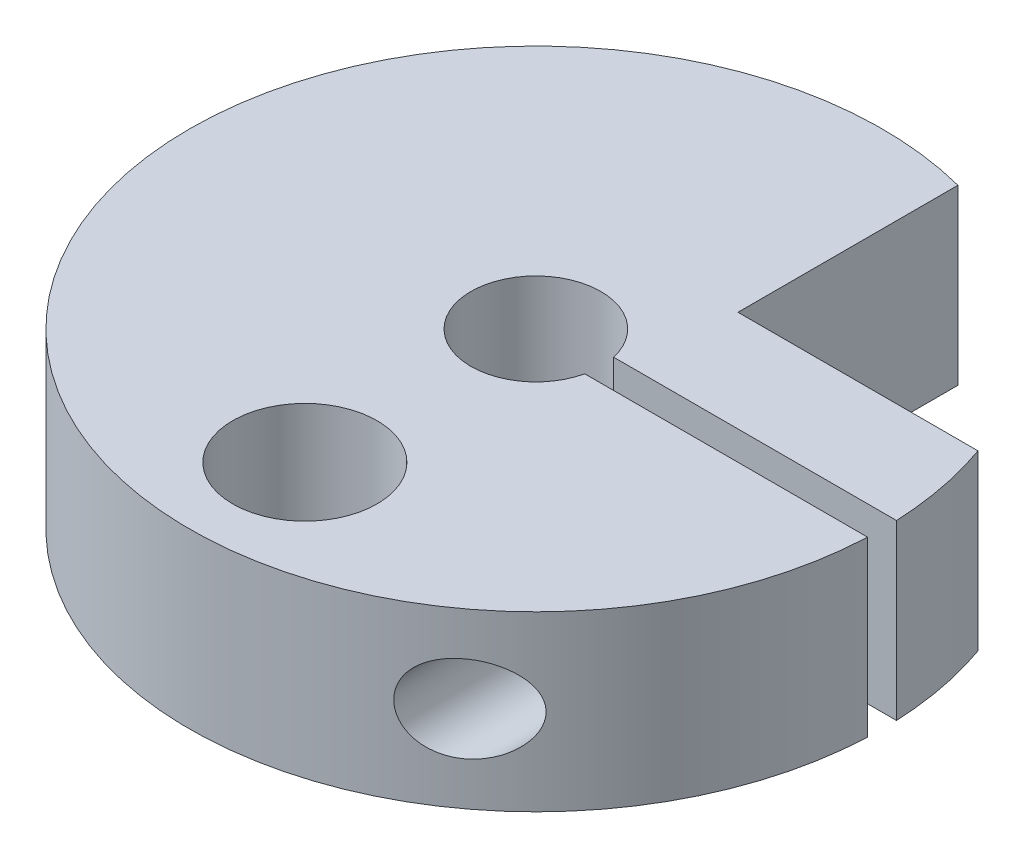
ISO-10303-21;
HEADER;
FILE_DESCRIPTION(('STEP AP214'),'2;1');
FILE_NAME('part.step','',(''),(''),'','','');
FILE_SCHEMA(('AUTOMOTIVE_DESIGN { 1 0 10303 214 1 1 1 1 }'));
ENDSEC;
DATA;
#1=APPLICATION_CONTEXT('core data for automotive mechanical design processes');
#2=APPLICATION_PROTOCOL_DEFINITION('international standard','automotive_design',2000,#1);
#3=PRODUCT_CONTEXT('',#1,'mechanical');
#4=PRODUCT('Part','Part','',(#3));
#5=PRODUCT_RELATED_PRODUCT_CATEGORY('part','',(#4));
#6=PRODUCT_DEFINITION_FORMATION('','',#4);
#7=PRODUCT_DEFINITION_CONTEXT('part definition',#1,'design');
#8=PRODUCT_DEFINITION('design','',#6,#7);
#9=PRODUCT_DEFINITION_SHAPE('','',#8);
#10=(LENGTH_UNIT() NAMED_UNIT(*) SI_UNIT(.MILLI.,.METRE.));
#11=(NAMED_UNIT(*) PLANE_ANGLE_UNIT() SI_UNIT($,.RADIAN.));
#12=(NAMED_UNIT(*) SI_UNIT($,.STERADIAN.) SOLID_ANGLE_UNIT());
#13=UNCERTAINTY_MEASURE_WITH_UNIT(LENGTH_MEASURE(1.E-05),#10,'distance_accuracy_value','');
#14=(GEOMETRIC_REPRESENTATION_CONTEXT(3) GLOBAL_UNCERTAINTY_ASSIGNED_CONTEXT((#13)) GLOBAL_UNIT_ASSIGNED_CONTEXT((#10,
#11,#12)) REPRESENTATION_CONTEXT('',''));
#15=CARTESIAN_POINT('',(0.,0.,0.));
#16=DIRECTION('',(0.,0.,1.));
#17=DIRECTION('',(1.,0.,0.));
#18=AXIS2_PLACEMENT_3D('',#15,#16,#17);
#19=CARTESIAN_POINT('',(0.,6.,0.));
#20=DIRECTION('',(0.,1.,0.));
#21=DIRECTION('',(0.,0.,1.));
#22=AXIS2_PLACEMENT_3D('',#19,#20,#21);
#23=PLANE('',#22);
#24=CARTESIAN_POINT('',(0.,6.,0.));
#25=DIRECTION('',(0.,-1.,0.));
#26=DIRECTION('',(0.,0.,1.));
#27=AXIS2_PLACEMENT_3D('',#24,#25,#26);
#28=CIRCLE('',#27,2.25);
#29=CARTESIAN_POINT('',(2.19374109684803,6.,0.5));
#30=VERTEX_POINT('',#29);
#31=CARTESIAN_POINT('',(2.19374109684803,6.,-0.5));
#32=VERTEX_POINT('',#31);
#33=EDGE_CURVE('E162',#30,#32,#28,.T.);
#34=ORIENTED_EDGE('',*,*,#33,.T.);
#35=DIRECTION('',(1.,0.,0.));
#36=VECTOR('',#35,1.);
#37=CARTESIAN_POINT('',(2.19374109684803,6.,-0.5));
#38=LINE('',#37,#36);
#39=CARTESIAN_POINT('',(11.9895788082818,6.,-0.5));
#40=VERTEX_POINT('',#39);
#41=EDGE_CURVE('E104',#32,#40,#38,.T.);
#42=ORIENTED_EDGE('',*,*,#41,.T.);
#43=CARTESIAN_POINT('',(0.,6.,0.));
#44=DIRECTION('',(0.,1.,0.));
#45=DIRECTION('',(0.,0.,1.));
#46=AXIS2_PLACEMENT_3D('',#43,#44,#45);
#47=CIRCLE('',#46,12.);
#48=CARTESIAN_POINT('',(11.3137084989848,6.,-4.));
#49=VERTEX_POINT('',#48);
#50=EDGE_CURVE('E180',#40,#49,#47,.T.);
#51=ORIENTED_EDGE('',*,*,#50,.T.);
#52=DIRECTION('',(-1.,0.,0.));
#53=VECTOR('',#52,1.);
#54=CARTESIAN_POINT('',(3.,6.,-4.));
#55=LINE('',#54,#53);
#56=CARTESIAN_POINT('',(3.,6.,-4.));
#57=VERTEX_POINT('',#56);
#58=EDGE_CURVE('E120',#49,#57,#55,.T.);
#59=ORIENTED_EDGE('',*,*,#58,.T.);
#60=DIRECTION('',(0.,0.,-1.));
#61=VECTOR('',#60,1.);
#62=CARTESIAN_POINT('',(3.,6.,-11.6189500386223));
#63=LINE('',#62,#61);
#64=CARTESIAN_POINT('',(3.,6.,-11.6189500386223));
#65=VERTEX_POINT('',#64);
#66=EDGE_CURVE('E114',#57,#65,#63,.T.);
#67=ORIENTED_EDGE('',*,*,#66,.T.);
#68=CARTESIAN_POINT('',(0.,6.,0.));
#69=DIRECTION('',(0.,1.,0.));
#70=DIRECTION('',(0.,0.,1.));
#71=AXIS2_PLACEMENT_3D('',#68,#69,#70);
#72=CIRCLE('',#71,12.);
#73=CARTESIAN_POINT('',(11.9895788082818,6.,0.5));
#74=VERTEX_POINT('',#73);
#75=EDGE_CURVE('E118',#65,#74,#72,.T.);
#76=ORIENTED_EDGE('',*,*,#75,.T.);
#77=DIRECTION('',(-1.,0.,0.));
#78=VECTOR('',#77,1.);
#79=CARTESIAN_POINT('',(2.19374109684803,6.,0.5));
#80=LINE('',#79,#78);
#81=EDGE_CURVE('E64',#74,#30,#80,.T.);
#82=ORIENTED_EDGE('',*,*,#81,.T.);
#83=EDGE_LOOP('',(#34,#42,#51,#59,#67,#76,#82));
#84=FACE_BOUND('',#83,.T.);
#85=CARTESIAN_POINT('',(0.,6.,8.));
#86=DIRECTION('',(0.,1.,0.));
#87=DIRECTION('',(0.,0.,1.));
#88=AXIS2_PLACEMENT_3D('',#85,#86,#87);
#89=CIRCLE('',#88,2.5);
#90=CARTESIAN_POINT('',(0.,6.,10.5));
#91=VERTEX_POINT('',#90);
#92=EDGE_CURVE('E147',#91,#91,#89,.T.);
#93=ORIENTED_EDGE('',*,*,#92,.F.);
#94=EDGE_LOOP('',(#93));
#95=FACE_BOUND('',#94,.T.);
#96=ADVANCED_FACE('F45',(#84,#95),#23,.T.);
#97=CARTESIAN_POINT('',(0.,0.,0.));
#98=DIRECTION('',(0.,1.,0.));
#99=DIRECTION('',(0.,0.,1.));
#100=AXIS2_PLACEMENT_3D('',#97,#98,#99);
#101=PLANE('',#100);
#102=CARTESIAN_POINT('',(0.,0.,0.));
#103=DIRECTION('',(0.,-1.,0.));
#104=DIRECTION('',(0.,0.,1.));
#105=AXIS2_PLACEMENT_3D('',#102,#103,#104);
#106=CIRCLE('',#105,2.25);
#107=CARTESIAN_POINT('',(2.19374109684803,0.,0.5));
#108=VERTEX_POINT('',#107);
#109=CARTESIAN_POINT('',(2.19374109684803,0.,-0.5));
#110=VERTEX_POINT('',#109);
#111=EDGE_CURVE('E142',#108,#110,#106,.T.);
#112=ORIENTED_EDGE('',*,*,#111,.F.);
#113=DIRECTION('',(-1.,0.,0.));
#114=VECTOR('',#113,1.);
#115=CARTESIAN_POINT('',(2.19374109684803,0.,0.5));
#116=LINE('',#115,#114);
#117=CARTESIAN_POINT('',(11.9895788082818,0.,0.5));
#118=VERTEX_POINT('',#117);
#119=EDGE_CURVE('E96',#118,#108,#116,.T.);
#120=ORIENTED_EDGE('',*,*,#119,.F.);
#121=CARTESIAN_POINT('',(0.,0.,0.));
#122=DIRECTION('',(0.,1.,0.));
#123=DIRECTION('',(0.,0.,1.));
#124=AXIS2_PLACEMENT_3D('',#121,#122,#123);
#125=CIRCLE('',#124,12.);
#126=CARTESIAN_POINT('',(3.,0.,-11.6189500386223));
#127=VERTEX_POINT('',#126);
#128=EDGE_CURVE('E90',#127,#118,#125,.T.);
#129=ORIENTED_EDGE('',*,*,#128,.F.);
#130=DIRECTION('',(0.,0.,-1.));
#131=VECTOR('',#130,1.);
#132=CARTESIAN_POINT('',(3.,0.,-11.6189500386223));
#133=LINE('',#132,#131);
#134=CARTESIAN_POINT('',(3.,0.,-4.));
#135=VERTEX_POINT('',#134);
#136=EDGE_CURVE('E129',#135,#127,#133,.T.);
#137=ORIENTED_EDGE('',*,*,#136,.F.);
#138=DIRECTION('',(-1.,0.,0.));
#139=VECTOR('',#138,1.);
#140=CARTESIAN_POINT('',(3.,0.,-4.));
#141=LINE('',#140,#139);
#142=CARTESIAN_POINT('',(11.3137084989848,0.,-4.));
#143=VERTEX_POINT('',#142);
#144=EDGE_CURVE('E153',#143,#135,#141,.T.);
#145=ORIENTED_EDGE('',*,*,#144,.F.);
#146=CARTESIAN_POINT('',(0.,0.,0.));
#147=DIRECTION('',(0.,1.,0.));
#148=DIRECTION('',(0.,0.,1.));
#149=AXIS2_PLACEMENT_3D('',#146,#147,#148);
#150=CIRCLE('',#149,12.);
#151=CARTESIAN_POINT('',(11.9895788082818,0.,-0.5));
#152=VERTEX_POINT('',#151);
#153=EDGE_CURVE('E150',#152,#143,#150,.T.);
#154=ORIENTED_EDGE('',*,*,#153,.F.);
#155=DIRECTION('',(1.,0.,0.));
#156=VECTOR('',#155,1.);
#157=CARTESIAN_POINT('',(2.19374109684803,0.,-0.5));
#158=LINE('',#157,#156);
#159=EDGE_CURVE('E146',#110,#152,#158,.T.);
#160=ORIENTED_EDGE('',*,*,#159,.F.);
#161=EDGE_LOOP('',(#112,#120,#129,#137,#145,#154,#160));
#162=FACE_BOUND('',#161,.T.);
#163=CARTESIAN_POINT('',(0.,0.,8.));
#164=DIRECTION('',(0.,1.,0.));
#165=DIRECTION('',(0.,0.,1.));
#166=AXIS2_PLACEMENT_3D('',#163,#164,#165);
#167=CIRCLE('',#166,2.5);
#168=CARTESIAN_POINT('',(0.,0.,10.5));
#169=VERTEX_POINT('',#168);
#170=EDGE_CURVE('E196',#169,#169,#167,.T.);
#171=ORIENTED_EDGE('',*,*,#170,.T.);
#172=EDGE_LOOP('',(#171));
#173=FACE_BOUND('',#172,.T.);
#174=ADVANCED_FACE('F184',(#162,#173),#101,.F.);
#175=CARTESIAN_POINT('',(0.,6.,0.));
#176=DIRECTION('',(0.,-1.,0.));
#177=DIRECTION('',(0.,0.,-1.));
#178=AXIS2_PLACEMENT_3D('',#175,#176,#177);
#179=CYLINDRICAL_SURFACE('',#178,2.25);
#180=ORIENTED_EDGE('',*,*,#111,.T.);
#181=DIRECTION('',(0.,-1.,0.));
#182=VECTOR('',#181,1.);
#183=CARTESIAN_POINT('',(2.19374109684803,6.,-0.5));
#184=LINE('',#183,#182);
#185=EDGE_CURVE('E11',#32,#110,#184,.T.);
#186=ORIENTED_EDGE('',*,*,#185,.F.);
#187=ORIENTED_EDGE('',*,*,#33,.F.);
#188=DIRECTION('',(0.,-1.,0.));
#189=VECTOR('',#188,1.);
#190=CARTESIAN_POINT('',(2.19374109684803,6.,0.5));
#191=LINE('',#190,#189);
#192=EDGE_CURVE('E138',#30,#108,#191,.T.);
#193=ORIENTED_EDGE('',*,*,#192,.T.);
#194=EDGE_LOOP('',(#180,#186,#187,#193));
#195=FACE_BOUND('',#194,.T.);
#196=ADVANCED_FACE('F47',(#195),#179,.F.);
#197=CARTESIAN_POINT('',(2.19374109684803,6.,-0.5));
#198=DIRECTION('',(0.,0.,-1.));
#199=DIRECTION('',(-1.,0.,0.));
#200=AXIS2_PLACEMENT_3D('',#197,#198,#199);
#201=PLANE('',#200);
#202=CARTESIAN_POINT('',(7.16,3.,-0.5));
#203=DIRECTION('',(0.,0.,-1.));
#204=DIRECTION('',(-1.,0.,0.));
#205=AXIS2_PLACEMENT_3D('',#202,#203,#204);
#206=CIRCLE('',#205,1.5);
#207=CARTESIAN_POINT('',(5.66,3.,-0.5));
#208=VERTEX_POINT('',#207);
#209=EDGE_CURVE('E200',#208,#208,#206,.T.);
#210=ORIENTED_EDGE('',*,*,#209,.T.);
#211=EDGE_LOOP('',(#210));
#212=FACE_BOUND('',#211,.T.);
#213=ORIENTED_EDGE('',*,*,#159,.T.);
#214=DIRECTION('',(0.,-1.,0.));
#215=VECTOR('',#214,1.);
#216=CARTESIAN_POINT('',(11.9895788082818,6.,-0.5));
#217=LINE('',#216,#215);
#218=EDGE_CURVE('E56',#40,#152,#217,.T.);
#219=ORIENTED_EDGE('',*,*,#218,.F.);
#220=ORIENTED_EDGE('',*,*,#41,.F.);
#221=ORIENTED_EDGE('',*,*,#185,.T.);
#222=EDGE_LOOP('',(#213,#219,#220,#221));
#223=FACE_BOUND('',#222,.T.);
#224=ADVANCED_FACE('F257',(#212,#223),#201,.F.);
#225=CARTESIAN_POINT('',(0.,6.,0.));
#226=DIRECTION('',(0.,-1.,0.));
#227=DIRECTION('',(0.,0.,-1.));
#228=AXIS2_PLACEMENT_3D('',#225,#226,#227);
#229=CYLINDRICAL_SURFACE('',#228,12.);
#230=ORIENTED_EDGE('',*,*,#153,.T.);
#231=DIRECTION('',(0.,-1.,0.));
#232=VECTOR('',#231,1.);
#233=CARTESIAN_POINT('',(11.3137084989848,6.,-4.));
#234=LINE('',#233,#232);
#235=EDGE_CURVE('E169',#49,#143,#234,.T.);
#236=ORIENTED_EDGE('',*,*,#235,.F.);
#237=ORIENTED_EDGE('',*,*,#50,.F.);
#238=ORIENTED_EDGE('',*,*,#218,.T.);
#239=EDGE_LOOP('',(#230,#236,#237,#238));
#240=FACE_BOUND('',#239,.T.);
#241=ADVANCED_FACE('F178',(#240),#229,.T.);
#242=CARTESIAN_POINT('',(3.,6.,-4.));
#243=DIRECTION('',(0.,0.,1.));
#244=DIRECTION('',(1.,0.,0.));
#245=AXIS2_PLACEMENT_3D('',#242,#243,#244);
#246=PLANE('',#245);
#247=CARTESIAN_POINT('',(7.16,3.,-4.));
#248=DIRECTION('',(0.,0.,-1.));
#249=DIRECTION('',(-1.,0.,0.));
#250=AXIS2_PLACEMENT_3D('',#247,#248,#249);
#251=CIRCLE('',#250,1.5);
#252=CARTESIAN_POINT('',(5.66,3.,-4.));
#253=VERTEX_POINT('',#252);
#254=EDGE_CURVE('E216',#253,#253,#251,.T.);
#255=ORIENTED_EDGE('',*,*,#254,.F.);
#256=EDGE_LOOP('',(#255));
#257=FACE_BOUND('',#256,.T.);
#258=ORIENTED_EDGE('',*,*,#144,.T.);
#259=DIRECTION('',(0.,-1.,0.));
#260=VECTOR('',#259,1.);
#261=CARTESIAN_POINT('',(3.,6.,-4.));
#262=LINE('',#261,#260);
#263=EDGE_CURVE('E131',#57,#135,#262,.T.);
#264=ORIENTED_EDGE('',*,*,#263,.F.);
#265=ORIENTED_EDGE('',*,*,#58,.F.);
#266=ORIENTED_EDGE('',*,*,#235,.T.);
#267=EDGE_LOOP('',(#258,#264,#265,#266));
#268=FACE_BOUND('',#267,.T.);
#269=ADVANCED_FACE('F187',(#257,#268),#246,.F.);
#270=CARTESIAN_POINT('',(3.,6.,-11.6189500386223));
#271=DIRECTION('',(-1.,0.,0.));
#272=DIRECTION('',(0.,0.,1.));
#273=AXIS2_PLACEMENT_3D('',#270,#271,#272);
#274=PLANE('',#273);
#275=ORIENTED_EDGE('',*,*,#136,.T.);
#276=DIRECTION('',(0.,-1.,0.));
#277=VECTOR('',#276,1.);
#278=CARTESIAN_POINT('',(3.,6.,-11.6189500386223));
#279=LINE('',#278,#277);
#280=EDGE_CURVE('E126',#65,#127,#279,.T.);
#281=ORIENTED_EDGE('',*,*,#280,.F.);
#282=ORIENTED_EDGE('',*,*,#66,.F.);
#283=ORIENTED_EDGE('',*,*,#263,.T.);
#284=EDGE_LOOP('',(#275,#281,#282,#283));
#285=FACE_BOUND('',#284,.T.);
#286=ADVANCED_FACE('F127',(#285),#274,.F.);
#287=CARTESIAN_POINT('',(0.,6.,0.));
#288=DIRECTION('',(0.,-1.,0.));
#289=DIRECTION('',(0.,0.,-1.));
#290=AXIS2_PLACEMENT_3D('',#287,#288,#289);
#291=CYLINDRICAL_SURFACE('',#290,12.);
#292=CARTESIAN_POINT('',(5.66,3.,10.5813231686779));
#293=CARTESIAN_POINT('',(5.65999700616026,3.07650820540452,10.5813243336983));
#294=CARTESIAN_POINT('',(5.66587599755908,3.1529985119283,10.5781862389138));
#295=CARTESIAN_POINT('',(5.68908767730524,3.3036847392857,10.5657206838779));
#296=CARTESIAN_POINT('',(5.70641803447849,3.37788112387958,10.5563944833483));
#297=CARTESIAN_POINT('',(5.75165340220269,3.52176597729793,10.5318154686848));
#298=CARTESIAN_POINT('',(5.77953931062155,3.59146232460138,10.5165733591753));
#299=CARTESIAN_POINT('',(5.84463127829465,3.72478377224544,10.4805373499687));
#300=CARTESIAN_POINT('',(5.88183883538463,3.78840789460824,10.4597425580114));
#301=CARTESIAN_POINT('',(5.96557000191042,3.91050355829342,10.4122220420786));
#302=CARTESIAN_POINT('',(6.0123857533211,3.96869977181699,10.3853064221651));
#303=CARTESIAN_POINT('',(6.11260652418617,4.07627971511422,10.3266360814422));
#304=CARTESIAN_POINT('',(6.16601348192594,4.12566084212875,10.2948799365243));
#305=CARTESIAN_POINT('',(6.28370680107082,4.21999751906684,10.223514543651));
#306=CARTESIAN_POINT('',(6.34854524828617,4.26390025756825,10.1834276390037));
#307=CARTESIAN_POINT('',(6.48204084846356,4.34025915279714,10.0989800195129));
#308=CARTESIAN_POINT('',(6.55070000853581,4.37270922618471,10.0546170492203));
#309=CARTESIAN_POINT('',(6.70044240188436,4.43044386693144,9.95556474295889));
#310=CARTESIAN_POINT('',(6.78184995937123,4.45393499659957,9.90032260486398));
#311=CARTESIAN_POINT('',(6.94512090290938,4.48686701169944,9.78648188367212));
#312=CARTESIAN_POINT('',(7.02698448413241,4.49630132854661,9.72788174469398));
#313=CARTESIAN_POINT('',(7.20309014629751,4.5023814334086,9.59840225329666));
#314=CARTESIAN_POINT('',(7.29711227183649,4.49662409228698,9.5271085572571));
#315=CARTESIAN_POINT('',(7.48147688002817,4.46811805839233,9.38302900874874));
#316=CARTESIAN_POINT('',(7.57181459629541,4.4453480490389,9.31024139579678));
#317=CARTESIAN_POINT('',(7.75832690146627,4.3794988753193,9.15559116228408));
#318=CARTESIAN_POINT('',(7.85375169051823,4.33417920311169,9.0737688169711));
#319=CARTESIAN_POINT('',(8.03507429166732,4.22292561480007,8.91359366409502));
#320=CARTESIAN_POINT('',(8.12098219743411,4.1570138279427,8.83523723460475));
#321=CARTESIAN_POINT('',(8.25465085701844,4.02830108884605,8.71012653598015));
#322=CARTESIAN_POINT('',(8.30586658786722,3.97114894340379,8.66123373487834));
#323=CARTESIAN_POINT('',(8.40065751337922,3.8466801937652,8.56932204719236));
#324=CARTESIAN_POINT('',(8.44424643942856,3.779382271595,8.52629263566041));
#325=CARTESIAN_POINT('',(8.51263278889461,3.65143101383627,8.45794698756353));
#326=CARTESIAN_POINT('',(8.53944559094192,3.59282486525614,8.43083430767719));
#327=CARTESIAN_POINT('',(8.58590913270392,3.47018260848796,8.38351151948522));
#328=CARTESIAN_POINT('',(8.60556486761207,3.40615032603379,8.36329659759011));
#329=CARTESIAN_POINT('',(8.63648221447863,3.27329143990598,8.33136760101605));
#330=CARTESIAN_POINT('',(8.64766109147399,3.20442457392628,8.31973734194));
#331=CARTESIAN_POINT('',(8.66022826587491,3.06486563329388,8.30665631311648));
#332=CARTESIAN_POINT('',(8.66162627035425,2.9941754381864,8.3051954507098));
#333=CARTESIAN_POINT('',(8.65504857551496,2.86425316790909,8.31204791952502));
#334=CARTESIAN_POINT('',(8.64842385782746,2.80486769128623,8.31895261660242));
#335=CARTESIAN_POINT('',(8.62848316853437,2.68847577766406,8.3396332659392));
#336=CARTESIAN_POINT('',(8.61516414775554,2.63147043761461,8.3534123493764));
#337=CARTESIAN_POINT('',(8.57840765428389,2.50666660537696,8.39117249326807));
#338=CARTESIAN_POINT('',(8.55324212468159,2.43990150793592,8.41687234213581));
#339=CARTESIAN_POINT('',(8.49531489260836,2.31311145402226,8.47533602861805));
#340=CARTESIAN_POINT('',(8.46253992657102,2.2530985412331,8.50811219347346));
#341=CARTESIAN_POINT('',(8.37796581200575,2.11974605791759,8.59152754681399));
#342=CARTESIAN_POINT('',(8.32357122836434,2.04942315009082,8.64434257864538));
#343=CARTESIAN_POINT('',(8.20629801546033,1.92166630833588,8.75575578067528));
#344=CARTESIAN_POINT('',(8.1434053269001,1.86425416252834,8.81436349021581));
#345=CARTESIAN_POINT('',(7.9928874238947,1.74794308249825,8.95135162848348));
#346=CARTESIAN_POINT('',(7.90319854894254,1.69292020012901,9.03076077593665));
#347=CARTESIAN_POINT('',(7.71579314996161,1.60289405036126,9.19139876561644));
#348=CARTESIAN_POINT('',(7.61807171295803,1.56790314093778,9.27262869907252));
#349=CARTESIAN_POINT('',(7.41623479322491,1.51837644939483,9.43484650515445));
#350=CARTESIAN_POINT('',(7.31208108637017,1.50397834478488,9.51582916933897));
#351=CARTESIAN_POINT('',(7.10069230653632,1.49745647343714,9.67458414656035));
#352=CARTESIAN_POINT('',(6.99346052150785,1.50530975479399,9.75235968371174));
#353=CARTESIAN_POINT('',(6.7995297240367,1.5412728689036,9.88826142310081));
#354=CARTESIAN_POINT('',(6.71274334759966,1.56531717265049,9.94734112362996));
#355=CARTESIAN_POINT('',(6.54211913313282,1.6301361414782,10.0603729064483));
#356=CARTESIAN_POINT('',(6.45827807103098,1.67089185200226,10.1143307130255));
#357=CARTESIAN_POINT('',(6.30899210273334,1.76215852708129,10.207997066577));
#358=CARTESIAN_POINT('',(6.24267421121588,1.81028915395198,10.2486289477797));
#359=CARTESIAN_POINT('',(6.11702568966393,1.9187587271569,10.324115603275));
#360=CARTESIAN_POINT('',(6.05769340616233,1.97909477528627,10.3589717454623));
#361=CARTESIAN_POINT('',(5.94840766995758,2.11148856186136,10.4221143006991));
#362=CARTESIAN_POINT('',(5.89851268860729,2.18361452636059,10.4503599973362));
#363=CARTESIAN_POINT('',(5.81133064735827,2.33750677614677,10.4990927186326));
#364=CARTESIAN_POINT('',(5.77403796968023,2.41926874397254,10.519583200855));
#365=CARTESIAN_POINT('',(5.71669552229315,2.58308487181431,10.5508474870806));
#366=CARTESIAN_POINT('',(5.69553954082771,2.66463219624677,10.5622477682237));
#367=CARTESIAN_POINT('',(5.66719718856734,2.83079475655769,10.5774829320415));
#368=CARTESIAN_POINT('',(5.66000331015394,2.91540831872824,10.5813218805672));
#369=CARTESIAN_POINT('',(5.66,3.,10.5813231686779));
#370=B_SPLINE_CURVE_WITH_KNOTS('',3,(#292,#293,#294,#295,#296,#297,#298,#299,#300,#301,#302,
#303,#304,#305,#306,#307,#308,#309,#310,#311,#312,#313,#314,#315,#316,#317,#318,#319,#320,#321,
#322,#323,#324,#325,#326,#327,#328,#329,#330,#331,#332,#333,#334,#335,#336,#337,#338,#339,#340,
#341,#342,#343,#344,#345,#346,#347,#348,#349,#350,#351,#352,#353,#354,#355,#356,#357,#358,#359,
#360,#361,#362,#363,#364,#365,#366,#367,#368,#369),.UNSPECIFIED.,.T.,.F.,(4,2,2,2,2,2,2,2,2,2,2,
2,2,2,2,2,2,2,2,2,2,2,2,2,2,2,2,2,2,2,2,2,2,2,2,2,2,2,4),(0.,0.229209203130142,
0.458371760120483,0.687121574478401,0.915908168772939,1.15310365014324,1.3903690508771,
1.65324130811915,1.91625298644861,2.21853698330768,2.52096218969839,2.87397456833284,
3.22743000873549,3.62647000049572,4.02508263183271,4.29721627091479,4.56885479992078,
4.77784490876904,4.98668887449229,5.1975458346224,5.40819349902931,5.58779941223702,
5.76748720798186,5.9937605822548,6.22043136145935,6.52898046028595,6.83804642092614,
7.23151921290594,7.62523448232924,8.02156990662216,8.41749666690817,8.73933506605584,
9.06080943219724,9.33406196933704,9.60724969804642,9.88207824257415,10.1567841135731,
10.4103468013562,10.6637731071128),.UNSPECIFIED.);
#371=CARTESIAN_POINT('',(5.66,3.,10.5813231686779));
#372=VERTEX_POINT('',#371);
#373=EDGE_CURVE('E207',#372,#372,#370,.T.);
#374=ORIENTED_EDGE('',*,*,#373,.T.);
#375=EDGE_LOOP('',(#374));
#376=FACE_BOUND('',#375,.T.);
#377=ORIENTED_EDGE('',*,*,#128,.T.);
#378=DIRECTION('',(0.,-1.,0.));
#379=VECTOR('',#378,1.);
#380=CARTESIAN_POINT('',(11.9895788082818,6.,0.5));
#381=LINE('',#380,#379);
#382=EDGE_CURVE('E132',#74,#118,#381,.T.);
#383=ORIENTED_EDGE('',*,*,#382,.F.);
#384=ORIENTED_EDGE('',*,*,#75,.F.);
#385=ORIENTED_EDGE('',*,*,#280,.T.);
#386=EDGE_LOOP('',(#377,#383,#384,#385));
#387=FACE_BOUND('',#386,.T.);
#388=ADVANCED_FACE('F134',(#376,#387),#291,.T.);
#389=CARTESIAN_POINT('',(2.19374109684803,6.,0.5));
#390=DIRECTION('',(0.,0.,1.));
#391=DIRECTION('',(1.,0.,0.));
#392=AXIS2_PLACEMENT_3D('',#389,#390,#391);
#393=PLANE('',#392);
#394=CARTESIAN_POINT('',(7.16,3.,0.5));
#395=DIRECTION('',(0.,0.,1.));
#396=DIRECTION('',(1.,0.,0.));
#397=AXIS2_PLACEMENT_3D('',#394,#395,#396);
#398=CIRCLE('',#397,1.5);
#399=CARTESIAN_POINT('',(8.66,3.,0.5));
#400=VERTEX_POINT('',#399);
#401=EDGE_CURVE('E49',#400,#400,#398,.T.);
#402=ORIENTED_EDGE('',*,*,#401,.T.);
#403=EDGE_LOOP('',(#402));
#404=FACE_BOUND('',#403,.T.);
#405=ORIENTED_EDGE('',*,*,#119,.T.);
#406=ORIENTED_EDGE('',*,*,#192,.F.);
#407=ORIENTED_EDGE('',*,*,#81,.F.);
#408=ORIENTED_EDGE('',*,*,#382,.T.);
#409=EDGE_LOOP('',(#405,#406,#407,#408));
#410=FACE_BOUND('',#409,.T.);
#411=ADVANCED_FACE('F229',(#404,#410),#393,.F.);
#412=CARTESIAN_POINT('',(0.,6.,8.));
#413=DIRECTION('',(0.,-1.,0.));
#414=DIRECTION('',(0.,0.,-1.));
#415=AXIS2_PLACEMENT_3D('',#412,#413,#414);
#416=CYLINDRICAL_SURFACE('',#415,2.5);
#417=ORIENTED_EDGE('',*,*,#92,.T.);
#418=EDGE_LOOP('',(#417));
#419=FACE_BOUND('',#418,.T.);
#420=ORIENTED_EDGE('',*,*,#170,.F.);
#421=EDGE_LOOP('',(#420));
#422=FACE_BOUND('',#421,.T.);
#423=ADVANCED_FACE('F226',(#419,#422),#416,.F.);
#424=CARTESIAN_POINT('',(7.16,3.,12.));
#425=DIRECTION('',(0.,0.,-1.));
#426=DIRECTION('',(-1.,0.,0.));
#427=AXIS2_PLACEMENT_3D('',#424,#425,#426);
#428=CYLINDRICAL_SURFACE('',#427,1.5);
#429=ORIENTED_EDGE('',*,*,#401,.F.);
#430=EDGE_LOOP('',(#429));
#431=FACE_BOUND('',#430,.T.);
#432=ORIENTED_EDGE('',*,*,#373,.F.);
#433=EDGE_LOOP('',(#432));
#434=FACE_BOUND('',#433,.T.);
#435=ADVANCED_FACE('F224',(#431,#434),#428,.F.);
#436=ORIENTED_EDGE('',*,*,#254,.T.);
#437=EDGE_LOOP('',(#436));
#438=FACE_BOUND('',#437,.T.);
#439=ORIENTED_EDGE('',*,*,#209,.F.);
#440=EDGE_LOOP('',(#439));
#441=FACE_BOUND('',#440,.T.);
#442=ADVANCED_FACE('F220',(#438,#441),#428,.F.);
#443=CLOSED_SHELL('',(#96,#174,#196,#224,#241,#269,#286,#388,#411,#423,#435,#442));
#444=MANIFOLD_SOLID_BREP('B2',#443);
#445=ADVANCED_BREP_SHAPE_REPRESENTATION('',(#18,#444),#14);
#446=SHAPE_DEFINITION_REPRESENTATION(#9,#445);
ENDSEC;
END-ISO-10303-21;
